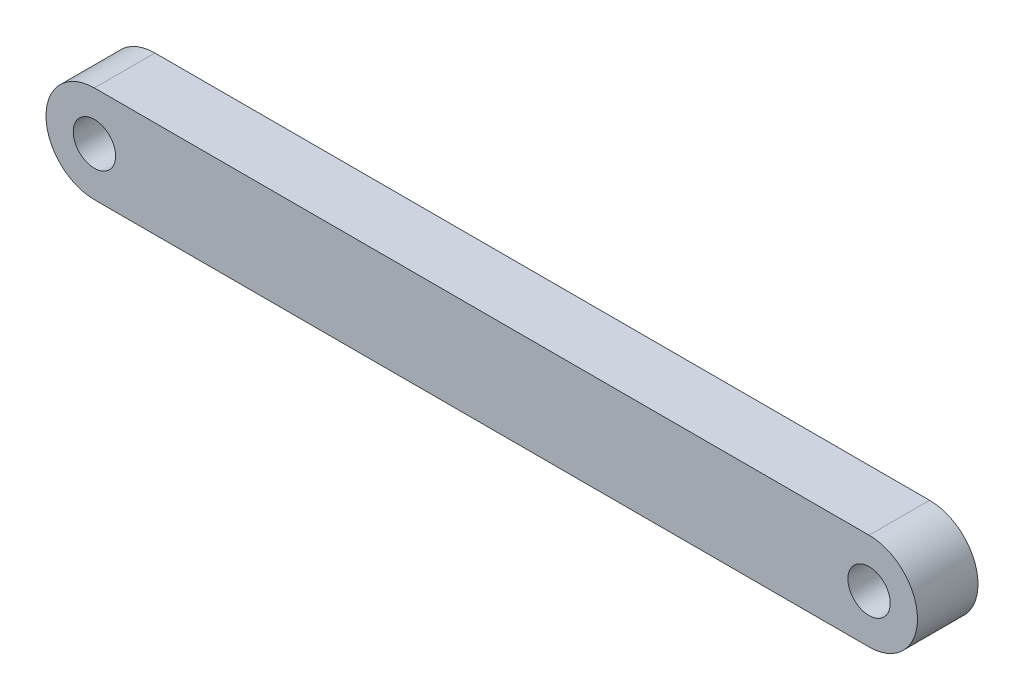
ISO-10303-21;
HEADER;
FILE_DESCRIPTION(('STEP AP214'),'2;1');
FILE_NAME('part.step','',(''),(''),'','','');
FILE_SCHEMA(('AUTOMOTIVE_DESIGN { 1 0 10303 214 1 1 1 1 }'));
ENDSEC;
DATA;
#1=APPLICATION_CONTEXT('core data for automotive mechanical design processes');
#2=APPLICATION_PROTOCOL_DEFINITION('international standard','automotive_design',2000,#1);
#3=PRODUCT_CONTEXT('',#1,'mechanical');
#4=PRODUCT('Part','Part','',(#3));
#5=PRODUCT_RELATED_PRODUCT_CATEGORY('part','',(#4));
#6=PRODUCT_DEFINITION_FORMATION('','',#4);
#7=PRODUCT_DEFINITION_CONTEXT('part definition',#1,'design');
#8=PRODUCT_DEFINITION('design','',#6,#7);
#9=PRODUCT_DEFINITION_SHAPE('','',#8);
#10=(LENGTH_UNIT() NAMED_UNIT(*) SI_UNIT(.MILLI.,.METRE.));
#11=(NAMED_UNIT(*) PLANE_ANGLE_UNIT() SI_UNIT($,.RADIAN.));
#12=(NAMED_UNIT(*) SI_UNIT($,.STERADIAN.) SOLID_ANGLE_UNIT());
#13=UNCERTAINTY_MEASURE_WITH_UNIT(LENGTH_MEASURE(1.E-05),#10,'distance_accuracy_value','');
#14=(GEOMETRIC_REPRESENTATION_CONTEXT(3) GLOBAL_UNCERTAINTY_ASSIGNED_CONTEXT((#13)) GLOBAL_UNIT_ASSIGNED_CONTEXT((#10,
#11,#12)) REPRESENTATION_CONTEXT('',''));
#15=CARTESIAN_POINT('',(0.,0.,0.));
#16=DIRECTION('',(0.,0.,1.));
#17=DIRECTION('',(1.,0.,0.));
#18=AXIS2_PLACEMENT_3D('',#15,#16,#17);
#19=CARTESIAN_POINT('',(0.,0.,5.));
#20=DIRECTION('',(0.,0.,1.));
#21=DIRECTION('',(1.,0.,0.));
#22=AXIS2_PLACEMENT_3D('',#19,#20,#21);
#23=PLANE('',#22);
#24=CARTESIAN_POINT('',(-64.0000000000001,0.,5.));
#25=DIRECTION('',(0.,0.,1.));
#26=DIRECTION('',(1.,0.,0.));
#27=AXIS2_PLACEMENT_3D('',#24,#25,#26);
#28=CIRCLE('',#27,1.74999999999893);
#29=CARTESIAN_POINT('',(-62.2500000000011,0.,5.));
#30=VERTEX_POINT('',#29);
#31=EDGE_CURVE('E118',#30,#30,#28,.T.);
#32=ORIENTED_EDGE('',*,*,#31,.F.);
#33=EDGE_LOOP('',(#32));
#34=FACE_BOUND('',#33,.T.);
#35=CARTESIAN_POINT('',(0.,0.,5.));
#36=DIRECTION('',(0.,0.,1.));
#37=DIRECTION('',(1.,0.,0.));
#38=AXIS2_PLACEMENT_3D('',#35,#36,#37);
#39=CIRCLE('',#38,4.);
#40=CARTESIAN_POINT('',(0.,-4.,5.));
#41=VERTEX_POINT('',#40);
#42=CARTESIAN_POINT('',(0.,4.,5.));
#43=VERTEX_POINT('',#42);
#44=EDGE_CURVE('E98',#41,#43,#39,.T.);
#45=ORIENTED_EDGE('',*,*,#44,.T.);
#46=DIRECTION('',(-1.,0.,0.));
#47=VECTOR('',#46,1.);
#48=CARTESIAN_POINT('',(0.,4.,5.));
#49=LINE('',#48,#47);
#50=CARTESIAN_POINT('',(-64.,4.,5.));
#51=VERTEX_POINT('',#50);
#52=EDGE_CURVE('E93',#43,#51,#49,.T.);
#53=ORIENTED_EDGE('',*,*,#52,.T.);
#54=CARTESIAN_POINT('',(-64.0000000000001,0.,5.));
#55=DIRECTION('',(0.,0.,1.));
#56=DIRECTION('',(1.,0.,0.));
#57=AXIS2_PLACEMENT_3D('',#54,#55,#56);
#58=CIRCLE('',#57,4.);
#59=CARTESIAN_POINT('',(-64.0000000000001,-4.,5.));
#60=VERTEX_POINT('',#59);
#61=EDGE_CURVE('E96',#51,#60,#58,.T.);
#62=ORIENTED_EDGE('',*,*,#61,.T.);
#63=DIRECTION('',(1.,0.,0.));
#64=VECTOR('',#63,1.);
#65=CARTESIAN_POINT('',(0.,-4.,5.));
#66=LINE('',#65,#64);
#67=EDGE_CURVE('E63',#60,#41,#66,.T.);
#68=ORIENTED_EDGE('',*,*,#67,.T.);
#69=EDGE_LOOP('',(#45,#53,#62,#68));
#70=FACE_BOUND('',#69,.T.);
#71=CARTESIAN_POINT('',(0.,0.,5.));
#72=DIRECTION('',(0.,0.,1.));
#73=DIRECTION('',(1.,0.,0.));
#74=AXIS2_PLACEMENT_3D('',#71,#72,#73);
#75=CIRCLE('',#74,1.74999999999992);
#76=CARTESIAN_POINT('',(1.74999999999992,0.,5.));
#77=VERTEX_POINT('',#76);
#78=EDGE_CURVE('E140',#77,#77,#75,.T.);
#79=ORIENTED_EDGE('',*,*,#78,.F.);
#80=EDGE_LOOP('',(#79));
#81=FACE_BOUND('',#80,.T.);
#82=ADVANCED_FACE('F45',(#34,#70,#81),#23,.T.);
#83=CARTESIAN_POINT('',(0.,0.,0.));
#84=DIRECTION('',(0.,0.,1.));
#85=DIRECTION('',(1.,0.,0.));
#86=AXIS2_PLACEMENT_3D('',#83,#84,#85);
#87=PLANE('',#86);
#88=CARTESIAN_POINT('',(0.,0.,0.));
#89=DIRECTION('',(0.,0.,1.));
#90=DIRECTION('',(1.,0.,0.));
#91=AXIS2_PLACEMENT_3D('',#88,#89,#90);
#92=CIRCLE('',#91,4.);
#93=CARTESIAN_POINT('',(0.,-4.,0.));
#94=VERTEX_POINT('',#93);
#95=CARTESIAN_POINT('',(0.,4.,0.));
#96=VERTEX_POINT('',#95);
#97=EDGE_CURVE('E114',#94,#96,#92,.T.);
#98=ORIENTED_EDGE('',*,*,#97,.F.);
#99=DIRECTION('',(1.,0.,0.));
#100=VECTOR('',#99,1.);
#101=CARTESIAN_POINT('',(0.,-4.,0.));
#102=LINE('',#101,#100);
#103=CARTESIAN_POINT('',(-64.0000000000001,-4.,0.));
#104=VERTEX_POINT('',#103);
#105=EDGE_CURVE('E86',#104,#94,#102,.T.);
#106=ORIENTED_EDGE('',*,*,#105,.F.);
#107=CARTESIAN_POINT('',(-64.0000000000001,0.,0.));
#108=DIRECTION('',(0.,0.,1.));
#109=DIRECTION('',(1.,0.,0.));
#110=AXIS2_PLACEMENT_3D('',#107,#108,#109);
#111=CIRCLE('',#110,4.);
#112=CARTESIAN_POINT('',(-64.,4.,0.));
#113=VERTEX_POINT('',#112);
#114=EDGE_CURVE('E80',#113,#104,#111,.T.);
#115=ORIENTED_EDGE('',*,*,#114,.F.);
#116=DIRECTION('',(-1.,0.,0.));
#117=VECTOR('',#116,1.);
#118=CARTESIAN_POINT('',(0.,4.,0.));
#119=LINE('',#118,#117);
#120=EDGE_CURVE('E103',#96,#113,#119,.T.);
#121=ORIENTED_EDGE('',*,*,#120,.F.);
#122=EDGE_LOOP('',(#98,#106,#115,#121));
#123=FACE_BOUND('',#122,.T.);
#124=CARTESIAN_POINT('',(-64.0000000000001,0.,0.));
#125=DIRECTION('',(0.,0.,1.));
#126=DIRECTION('',(1.,0.,0.));
#127=AXIS2_PLACEMENT_3D('',#124,#125,#126);
#128=CIRCLE('',#127,1.74999999999893);
#129=CARTESIAN_POINT('',(-62.2500000000011,0.,0.));
#130=VERTEX_POINT('',#129);
#131=EDGE_CURVE('E136',#130,#130,#128,.T.);
#132=ORIENTED_EDGE('',*,*,#131,.T.);
#133=EDGE_LOOP('',(#132));
#134=FACE_BOUND('',#133,.T.);
#135=CARTESIAN_POINT('',(0.,0.,0.));
#136=DIRECTION('',(0.,0.,1.));
#137=DIRECTION('',(1.,0.,0.));
#138=AXIS2_PLACEMENT_3D('',#135,#136,#137);
#139=CIRCLE('',#138,1.74999999999992);
#140=CARTESIAN_POINT('',(1.74999999999992,0.,0.));
#141=VERTEX_POINT('',#140);
#142=EDGE_CURVE('E144',#141,#141,#139,.T.);
#143=ORIENTED_EDGE('',*,*,#142,.T.);
#144=EDGE_LOOP('',(#143));
#145=FACE_BOUND('',#144,.T.);
#146=ADVANCED_FACE('F131',(#123,#134,#145),#87,.F.);
#147=CARTESIAN_POINT('',(0.,0.,5.));
#148=DIRECTION('',(0.,0.,-1.));
#149=DIRECTION('',(-1.,0.,0.));
#150=AXIS2_PLACEMENT_3D('',#147,#148,#149);
#151=CYLINDRICAL_SURFACE('',#150,4.);
#152=ORIENTED_EDGE('',*,*,#97,.T.);
#153=DIRECTION('',(0.,0.,-1.));
#154=VECTOR('',#153,1.);
#155=CARTESIAN_POINT('',(0.,4.,5.));
#156=LINE('',#155,#154);
#157=EDGE_CURVE('E11',#43,#96,#156,.T.);
#158=ORIENTED_EDGE('',*,*,#157,.F.);
#159=ORIENTED_EDGE('',*,*,#44,.F.);
#160=DIRECTION('',(0.,0.,-1.));
#161=VECTOR('',#160,1.);
#162=CARTESIAN_POINT('',(0.,-4.,5.));
#163=LINE('',#162,#161);
#164=EDGE_CURVE('E110',#41,#94,#163,.T.);
#165=ORIENTED_EDGE('',*,*,#164,.T.);
#166=EDGE_LOOP('',(#152,#158,#159,#165));
#167=FACE_BOUND('',#166,.T.);
#168=ADVANCED_FACE('F47',(#167),#151,.T.);
#169=CARTESIAN_POINT('',(0.,4.,5.));
#170=DIRECTION('',(0.,-1.,0.));
#171=DIRECTION('',(1.,0.,0.));
#172=AXIS2_PLACEMENT_3D('',#169,#170,#171);
#173=PLANE('',#172);
#174=ORIENTED_EDGE('',*,*,#120,.T.);
#175=DIRECTION('',(0.,0.,-1.));
#176=VECTOR('',#175,1.);
#177=CARTESIAN_POINT('',(-64.,4.,5.));
#178=LINE('',#177,#176);
#179=EDGE_CURVE('E55',#51,#113,#178,.T.);
#180=ORIENTED_EDGE('',*,*,#179,.F.);
#181=ORIENTED_EDGE('',*,*,#52,.F.);
#182=ORIENTED_EDGE('',*,*,#157,.T.);
#183=EDGE_LOOP('',(#174,#180,#181,#182));
#184=FACE_BOUND('',#183,.T.);
#185=ADVANCED_FACE('F102',(#184),#173,.F.);
#186=CARTESIAN_POINT('',(-64.0000000000001,0.,5.));
#187=DIRECTION('',(0.,0.,-1.));
#188=DIRECTION('',(-1.,0.,0.));
#189=AXIS2_PLACEMENT_3D('',#186,#187,#188);
#190=CYLINDRICAL_SURFACE('',#189,4.);
#191=ORIENTED_EDGE('',*,*,#114,.T.);
#192=DIRECTION('',(0.,0.,-1.));
#193=VECTOR('',#192,1.);
#194=CARTESIAN_POINT('',(-64.0000000000001,-4.,5.));
#195=LINE('',#194,#193);
#196=EDGE_CURVE('E105',#60,#104,#195,.T.);
#197=ORIENTED_EDGE('',*,*,#196,.F.);
#198=ORIENTED_EDGE('',*,*,#61,.F.);
#199=ORIENTED_EDGE('',*,*,#179,.T.);
#200=EDGE_LOOP('',(#191,#197,#198,#199));
#201=FACE_BOUND('',#200,.T.);
#202=ADVANCED_FACE('F106',(#201),#190,.T.);
#203=CARTESIAN_POINT('',(0.,-4.,5.));
#204=DIRECTION('',(0.,1.,0.));
#205=DIRECTION('',(0.,0.,1.));
#206=AXIS2_PLACEMENT_3D('',#203,#204,#205);
#207=PLANE('',#206);
#208=ORIENTED_EDGE('',*,*,#105,.T.);
#209=ORIENTED_EDGE('',*,*,#164,.F.);
#210=ORIENTED_EDGE('',*,*,#67,.F.);
#211=ORIENTED_EDGE('',*,*,#196,.T.);
#212=EDGE_LOOP('',(#208,#209,#210,#211));
#213=FACE_BOUND('',#212,.T.);
#214=ADVANCED_FACE('F128',(#213),#207,.F.);
#215=CARTESIAN_POINT('',(-64.0000000000001,0.,5.));
#216=DIRECTION('',(0.,0.,-1.));
#217=DIRECTION('',(-1.,0.,0.));
#218=AXIS2_PLACEMENT_3D('',#215,#216,#217);
#219=CYLINDRICAL_SURFACE('',#218,1.74999999999893);
#220=ORIENTED_EDGE('',*,*,#31,.T.);
#221=EDGE_LOOP('',(#220));
#222=FACE_BOUND('',#221,.T.);
#223=ORIENTED_EDGE('',*,*,#131,.F.);
#224=EDGE_LOOP('',(#223));
#225=FACE_BOUND('',#224,.T.);
#226=ADVANCED_FACE('F163',(#222,#225),#219,.F.);
#227=CARTESIAN_POINT('',(0.,0.,5.));
#228=DIRECTION('',(0.,0.,-1.));
#229=DIRECTION('',(-1.,0.,0.));
#230=AXIS2_PLACEMENT_3D('',#227,#228,#229);
#231=CYLINDRICAL_SURFACE('',#230,1.74999999999992);
#232=ORIENTED_EDGE('',*,*,#78,.T.);
#233=EDGE_LOOP('',(#232));
#234=FACE_BOUND('',#233,.T.);
#235=ORIENTED_EDGE('',*,*,#142,.F.);
#236=EDGE_LOOP('',(#235));
#237=FACE_BOUND('',#236,.T.);
#238=ADVANCED_FACE('F152',(#234,#237),#231,.F.);
#239=CLOSED_SHELL('',(#82,#146,#168,#185,#202,#214,#226,#238));
#240=MANIFOLD_SOLID_BREP('B2',#239);
#241=ADVANCED_BREP_SHAPE_REPRESENTATION('',(#18,#240),#14);
#242=SHAPE_DEFINITION_REPRESENTATION(#9,#241);
ENDSEC;
END-ISO-10303-21;
